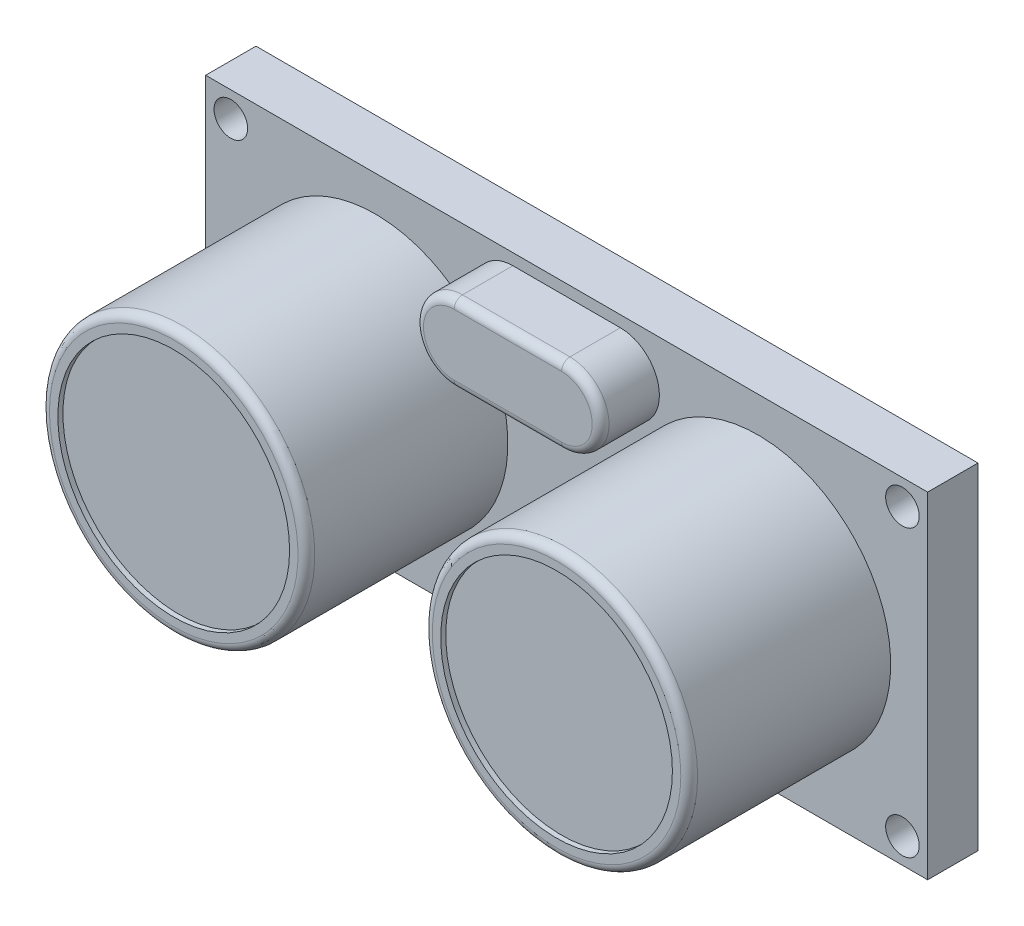
ISO-10303-21;
HEADER;
FILE_DESCRIPTION(('STEP AP214'),'2;1');
FILE_NAME('part.step','',(''),(''),'','','');
FILE_SCHEMA(('AUTOMOTIVE_DESIGN { 1 0 10303 214 1 1 1 1 }'));
ENDSEC;
DATA;
#1=APPLICATION_CONTEXT('core data for automotive mechanical design processes');
#2=APPLICATION_PROTOCOL_DEFINITION('international standard','automotive_design',2000,#1);
#3=PRODUCT_CONTEXT('',#1,'mechanical');
#4=PRODUCT('Part','Part','',(#3));
#5=PRODUCT_RELATED_PRODUCT_CATEGORY('part','',(#4));
#6=PRODUCT_DEFINITION_FORMATION('','',#4);
#7=PRODUCT_DEFINITION_CONTEXT('part definition',#1,'design');
#8=PRODUCT_DEFINITION('design','',#6,#7);
#9=PRODUCT_DEFINITION_SHAPE('','',#8);
#10=(LENGTH_UNIT() NAMED_UNIT(*) SI_UNIT(.MILLI.,.METRE.));
#11=(NAMED_UNIT(*) PLANE_ANGLE_UNIT() SI_UNIT($,.RADIAN.));
#12=(NAMED_UNIT(*) SI_UNIT($,.STERADIAN.) SOLID_ANGLE_UNIT());
#13=UNCERTAINTY_MEASURE_WITH_UNIT(LENGTH_MEASURE(1.E-05),#10,'distance_accuracy_value','');
#14=(GEOMETRIC_REPRESENTATION_CONTEXT(3) GLOBAL_UNCERTAINTY_ASSIGNED_CONTEXT((#13)) GLOBAL_UNIT_ASSIGNED_CONTEXT((#10,
#11,#12)) REPRESENTATION_CONTEXT('',''));
#15=CARTESIAN_POINT('',(0.,0.,0.));
#16=DIRECTION('',(0.,0.,1.));
#17=DIRECTION('',(1.,0.,0.));
#18=AXIS2_PLACEMENT_3D('',#15,#16,#17);
#19=CARTESIAN_POINT('',(0.,0.,3.));
#20=DIRECTION('',(0.,0.,-1.));
#21=DIRECTION('',(-1.,0.,0.));
#22=AXIS2_PLACEMENT_3D('',#19,#20,#21);
#23=PLANE('',#22);
#24=DIRECTION('',(0.,1.,0.));
#25=VECTOR('',#24,1.);
#26=CARTESIAN_POINT('',(21.5,-10.,3.));
#27=LINE('',#26,#25);
#28=CARTESIAN_POINT('',(21.5,-10.,3.));
#29=VERTEX_POINT('',#28);
#30=CARTESIAN_POINT('',(21.5,10.,3.));
#31=VERTEX_POINT('',#30);
#32=EDGE_CURVE('E182',#29,#31,#27,.T.);
#33=ORIENTED_EDGE('',*,*,#32,.T.);
#34=DIRECTION('',(-1.,0.,0.));
#35=VECTOR('',#34,1.);
#36=CARTESIAN_POINT('',(-21.5,10.,3.));
#37=LINE('',#36,#35);
#38=CARTESIAN_POINT('',(-21.5,10.,3.));
#39=VERTEX_POINT('',#38);
#40=EDGE_CURVE('E185',#31,#39,#37,.T.);
#41=ORIENTED_EDGE('',*,*,#40,.T.);
#42=DIRECTION('',(0.,-1.,0.));
#43=VECTOR('',#42,1.);
#44=CARTESIAN_POINT('',(-21.5,-10.,3.));
#45=LINE('',#44,#43);
#46=CARTESIAN_POINT('',(-21.5,-10.,3.));
#47=VERTEX_POINT('',#46);
#48=EDGE_CURVE('E188',#39,#47,#45,.T.);
#49=ORIENTED_EDGE('',*,*,#48,.T.);
#50=DIRECTION('',(1.,0.,0.));
#51=VECTOR('',#50,1.);
#52=CARTESIAN_POINT('',(-21.5,-10.,3.));
#53=LINE('',#52,#51);
#54=EDGE_CURVE('E190',#47,#29,#53,.T.);
#55=ORIENTED_EDGE('',*,*,#54,.T.);
#56=EDGE_LOOP('',(#33,#41,#49,#55));
#57=FACE_BOUND('',#56,.T.);
#58=CARTESIAN_POINT('',(20.,8.5,3.));
#59=DIRECTION('',(0.,0.,-1.));
#60=DIRECTION('',(-1.,0.,0.));
#61=AXIS2_PLACEMENT_3D('',#58,#59,#60);
#62=CIRCLE('',#61,1.);
#63=CARTESIAN_POINT('',(19.,8.5,3.));
#64=VERTEX_POINT('',#63);
#65=EDGE_CURVE('E169',#64,#64,#62,.T.);
#66=ORIENTED_EDGE('',*,*,#65,.T.);
#67=EDGE_LOOP('',(#66));
#68=FACE_BOUND('',#67,.T.);
#69=CARTESIAN_POINT('',(-20.,-8.49999999999999,3.));
#70=DIRECTION('',(0.,0.,-1.));
#71=DIRECTION('',(-1.,0.,0.));
#72=AXIS2_PLACEMENT_3D('',#69,#70,#71);
#73=CIRCLE('',#72,1.);
#74=CARTESIAN_POINT('',(-21.,-8.49999999999999,3.));
#75=VERTEX_POINT('',#74);
#76=EDGE_CURVE('E172',#75,#75,#73,.T.);
#77=ORIENTED_EDGE('',*,*,#76,.T.);
#78=EDGE_LOOP('',(#77));
#79=FACE_BOUND('',#78,.T.);
#80=CARTESIAN_POINT('',(20.,-8.5,3.));
#81=DIRECTION('',(0.,0.,-1.));
#82=DIRECTION('',(-1.,0.,0.));
#83=AXIS2_PLACEMENT_3D('',#80,#81,#82);
#84=CIRCLE('',#83,1.);
#85=CARTESIAN_POINT('',(19.,-8.5,3.));
#86=VERTEX_POINT('',#85);
#87=EDGE_CURVE('E175',#86,#86,#84,.T.);
#88=ORIENTED_EDGE('',*,*,#87,.T.);
#89=EDGE_LOOP('',(#88));
#90=FACE_BOUND('',#89,.T.);
#91=CARTESIAN_POINT('',(-20.,8.49999999999999,3.));
#92=DIRECTION('',(0.,0.,-1.));
#93=DIRECTION('',(-1.,0.,0.));
#94=AXIS2_PLACEMENT_3D('',#91,#92,#93);
#95=CIRCLE('',#94,1.);
#96=CARTESIAN_POINT('',(-21.,8.49999999999999,3.));
#97=VERTEX_POINT('',#96);
#98=EDGE_CURVE('E178',#97,#97,#95,.T.);
#99=ORIENTED_EDGE('',*,*,#98,.T.);
#100=EDGE_LOOP('',(#99));
#101=FACE_BOUND('',#100,.T.);
#102=CARTESIAN_POINT('',(11.4,0.,3.));
#103=DIRECTION('',(0.,0.,-1.));
#104=DIRECTION('',(-1.,0.,0.));
#105=AXIS2_PLACEMENT_3D('',#102,#103,#104);
#106=CIRCLE('',#105,7.9);
#107=CARTESIAN_POINT('',(3.5,0.,3.));
#108=VERTEX_POINT('',#107);
#109=EDGE_CURVE('E211',#108,#108,#106,.F.);
#110=ORIENTED_EDGE('',*,*,#109,.F.);
#111=EDGE_LOOP('',(#110));
#112=FACE_BOUND('',#111,.T.);
#113=CARTESIAN_POINT('',(-11.4,0.,3.));
#114=DIRECTION('',(0.,0.,-1.));
#115=DIRECTION('',(-1.,0.,0.));
#116=AXIS2_PLACEMENT_3D('',#113,#114,#115);
#117=CIRCLE('',#116,7.9);
#118=CARTESIAN_POINT('',(-19.3,0.,3.));
#119=VERTEX_POINT('',#118);
#120=EDGE_CURVE('E214',#119,#119,#117,.F.);
#121=ORIENTED_EDGE('',*,*,#120,.F.);
#122=EDGE_LOOP('',(#121));
#123=FACE_BOUND('',#122,.T.);
#124=CARTESIAN_POINT('',(-3.2,7.,3.));
#125=DIRECTION('',(0.,0.,1.));
#126=DIRECTION('',(1.,0.,0.));
#127=AXIS2_PLACEMENT_3D('',#124,#125,#126);
#128=CIRCLE('',#127,2.325);
#129=CARTESIAN_POINT('',(-3.2,9.325,3.));
#130=VERTEX_POINT('',#129);
#131=CARTESIAN_POINT('',(-3.2,4.675,3.));
#132=VERTEX_POINT('',#131);
#133=EDGE_CURVE('E117',#130,#132,#128,.T.);
#134=ORIENTED_EDGE('',*,*,#133,.F.);
#135=DIRECTION('',(-1.,0.,0.));
#136=VECTOR('',#135,1.);
#137=CARTESIAN_POINT('',(-3.2,9.325,3.));
#138=LINE('',#137,#136);
#139=CARTESIAN_POINT('',(3.2,9.325,3.));
#140=VERTEX_POINT('',#139);
#141=EDGE_CURVE('E124',#140,#130,#138,.T.);
#142=ORIENTED_EDGE('',*,*,#141,.F.);
#143=CARTESIAN_POINT('',(3.2,7.,3.));
#144=DIRECTION('',(0.,0.,1.));
#145=DIRECTION('',(1.,0.,0.));
#146=AXIS2_PLACEMENT_3D('',#143,#144,#145);
#147=CIRCLE('',#146,2.325);
#148=CARTESIAN_POINT('',(3.2,4.675,3.));
#149=VERTEX_POINT('',#148);
#150=EDGE_CURVE('E135',#149,#140,#147,.T.);
#151=ORIENTED_EDGE('',*,*,#150,.F.);
#152=DIRECTION('',(1.,0.,0.));
#153=VECTOR('',#152,1.);
#154=CARTESIAN_POINT('',(-3.2,4.675,3.));
#155=LINE('',#154,#153);
#156=EDGE_CURVE('E132',#132,#149,#155,.T.);
#157=ORIENTED_EDGE('',*,*,#156,.F.);
#158=EDGE_LOOP('',(#134,#142,#151,#157));
#159=FACE_BOUND('',#158,.T.);
#160=ADVANCED_FACE('F36',(#57,#68,#79,#90,#101,#112,#123,#159),#23,.F.);
#161=CARTESIAN_POINT('',(21.5,-10.,3.));
#162=DIRECTION('',(-1.,0.,0.));
#163=DIRECTION('',(0.,0.,1.));
#164=AXIS2_PLACEMENT_3D('',#161,#162,#163);
#165=PLANE('',#164);
#166=DIRECTION('',(0.,1.,0.));
#167=VECTOR('',#166,1.);
#168=CARTESIAN_POINT('',(21.5,-10.,0.));
#169=LINE('',#168,#167);
#170=CARTESIAN_POINT('',(21.5,-10.,0.));
#171=VERTEX_POINT('',#170);
#172=CARTESIAN_POINT('',(21.5,10.,0.));
#173=VERTEX_POINT('',#172);
#174=EDGE_CURVE('E181',#171,#173,#169,.T.);
#175=ORIENTED_EDGE('',*,*,#174,.T.);
#176=DIRECTION('',(0.,0.,-1.));
#177=VECTOR('',#176,1.);
#178=CARTESIAN_POINT('',(21.5,10.,3.));
#179=LINE('',#178,#177);
#180=EDGE_CURVE('E208',#31,#173,#179,.T.);
#181=ORIENTED_EDGE('',*,*,#180,.F.);
#182=ORIENTED_EDGE('',*,*,#32,.F.);
#183=DIRECTION('',(0.,0.,-1.));
#184=VECTOR('',#183,1.);
#185=CARTESIAN_POINT('',(21.5,-10.,3.));
#186=LINE('',#185,#184);
#187=EDGE_CURVE('E192',#29,#171,#186,.T.);
#188=ORIENTED_EDGE('',*,*,#187,.T.);
#189=EDGE_LOOP('',(#175,#181,#182,#188));
#190=FACE_BOUND('',#189,.T.);
#191=ADVANCED_FACE('F275',(#190),#165,.F.);
#192=CARTESIAN_POINT('',(-21.5,10.,3.));
#193=DIRECTION('',(0.,-1.,0.));
#194=DIRECTION('',(0.,0.,-1.));
#195=AXIS2_PLACEMENT_3D('',#192,#193,#194);
#196=PLANE('',#195);
#197=DIRECTION('',(-1.,0.,0.));
#198=VECTOR('',#197,1.);
#199=CARTESIAN_POINT('',(-21.5,10.,0.));
#200=LINE('',#199,#198);
#201=CARTESIAN_POINT('',(-21.5,10.,0.));
#202=VERTEX_POINT('',#201);
#203=EDGE_CURVE('E195',#173,#202,#200,.T.);
#204=ORIENTED_EDGE('',*,*,#203,.T.);
#205=DIRECTION('',(0.,0.,-1.));
#206=VECTOR('',#205,1.);
#207=CARTESIAN_POINT('',(-21.5,10.,3.));
#208=LINE('',#207,#206);
#209=EDGE_CURVE('E205',#39,#202,#208,.T.);
#210=ORIENTED_EDGE('',*,*,#209,.F.);
#211=ORIENTED_EDGE('',*,*,#40,.F.);
#212=ORIENTED_EDGE('',*,*,#180,.T.);
#213=EDGE_LOOP('',(#204,#210,#211,#212));
#214=FACE_BOUND('',#213,.T.);
#215=ADVANCED_FACE('F281',(#214),#196,.F.);
#216=CARTESIAN_POINT('',(-21.5,-10.,3.));
#217=DIRECTION('',(1.,0.,0.));
#218=DIRECTION('',(0.,0.,-1.));
#219=AXIS2_PLACEMENT_3D('',#216,#217,#218);
#220=PLANE('',#219);
#221=DIRECTION('',(0.,-1.,0.));
#222=VECTOR('',#221,1.);
#223=CARTESIAN_POINT('',(-21.5,-10.,0.));
#224=LINE('',#223,#222);
#225=CARTESIAN_POINT('',(-21.5,-10.,0.));
#226=VERTEX_POINT('',#225);
#227=EDGE_CURVE('E197',#202,#226,#224,.T.);
#228=ORIENTED_EDGE('',*,*,#227,.T.);
#229=DIRECTION('',(0.,0.,-1.));
#230=VECTOR('',#229,1.);
#231=CARTESIAN_POINT('',(-21.5,-10.,3.));
#232=LINE('',#231,#230);
#233=EDGE_CURVE('E202',#47,#226,#232,.T.);
#234=ORIENTED_EDGE('',*,*,#233,.F.);
#235=ORIENTED_EDGE('',*,*,#48,.F.);
#236=ORIENTED_EDGE('',*,*,#209,.T.);
#237=EDGE_LOOP('',(#228,#234,#235,#236));
#238=FACE_BOUND('',#237,.T.);
#239=ADVANCED_FACE('F296',(#238),#220,.F.);
#240=CARTESIAN_POINT('',(-21.5,-10.,3.));
#241=DIRECTION('',(0.,1.,0.));
#242=DIRECTION('',(0.,0.,1.));
#243=AXIS2_PLACEMENT_3D('',#240,#241,#242);
#244=PLANE('',#243);
#245=DIRECTION('',(1.,0.,0.));
#246=VECTOR('',#245,1.);
#247=CARTESIAN_POINT('',(-21.5,-10.,0.));
#248=LINE('',#247,#246);
#249=EDGE_CURVE('E186',#226,#171,#248,.T.);
#250=ORIENTED_EDGE('',*,*,#249,.T.);
#251=ORIENTED_EDGE('',*,*,#187,.F.);
#252=ORIENTED_EDGE('',*,*,#54,.F.);
#253=ORIENTED_EDGE('',*,*,#233,.T.);
#254=EDGE_LOOP('',(#250,#251,#252,#253));
#255=FACE_BOUND('',#254,.T.);
#256=ADVANCED_FACE('F292',(#255),#244,.F.);
#257=CARTESIAN_POINT('',(0.,0.,0.));
#258=DIRECTION('',(0.,0.,-1.));
#259=DIRECTION('',(-1.,0.,0.));
#260=AXIS2_PLACEMENT_3D('',#257,#258,#259);
#261=PLANE('',#260);
#262=CARTESIAN_POINT('',(-20.,8.49999999999999,0.));
#263=DIRECTION('',(0.,0.,1.));
#264=DIRECTION('',(-1.,0.,0.));
#265=AXIS2_PLACEMENT_3D('',#262,#263,#264);
#266=CIRCLE('',#265,1.);
#267=CARTESIAN_POINT('',(-21.,8.49999999999999,0.));
#268=VERTEX_POINT('',#267);
#269=EDGE_CURVE('E161',#268,#268,#266,.T.);
#270=ORIENTED_EDGE('',*,*,#269,.T.);
#271=EDGE_LOOP('',(#270));
#272=FACE_BOUND('',#271,.T.);
#273=CARTESIAN_POINT('',(20.,-8.5,0.));
#274=DIRECTION('',(0.,0.,1.));
#275=DIRECTION('',(-1.,0.,0.));
#276=AXIS2_PLACEMENT_3D('',#273,#274,#275);
#277=CIRCLE('',#276,1.);
#278=CARTESIAN_POINT('',(19.,-8.5,0.));
#279=VERTEX_POINT('',#278);
#280=EDGE_CURVE('E160',#279,#279,#277,.T.);
#281=ORIENTED_EDGE('',*,*,#280,.T.);
#282=EDGE_LOOP('',(#281));
#283=FACE_BOUND('',#282,.T.);
#284=CARTESIAN_POINT('',(-20.,-8.49999999999999,0.));
#285=DIRECTION('',(0.,0.,1.));
#286=DIRECTION('',(1.,0.,0.));
#287=AXIS2_PLACEMENT_3D('',#284,#285,#286);
#288=CIRCLE('',#287,1.);
#289=CARTESIAN_POINT('',(-19.,-8.49999999999999,0.));
#290=VERTEX_POINT('',#289);
#291=EDGE_CURVE('E149',#290,#290,#288,.T.);
#292=ORIENTED_EDGE('',*,*,#291,.T.);
#293=EDGE_LOOP('',(#292));
#294=FACE_BOUND('',#293,.T.);
#295=CARTESIAN_POINT('',(20.,8.5,0.));
#296=DIRECTION('',(0.,0.,1.));
#297=DIRECTION('',(1.,0.,0.));
#298=AXIS2_PLACEMENT_3D('',#295,#296,#297);
#299=CIRCLE('',#298,1.);
#300=CARTESIAN_POINT('',(21.,8.5,0.));
#301=VERTEX_POINT('',#300);
#302=EDGE_CURVE('E164',#301,#301,#299,.T.);
#303=ORIENTED_EDGE('',*,*,#302,.T.);
#304=EDGE_LOOP('',(#303));
#305=FACE_BOUND('',#304,.T.);
#306=ORIENTED_EDGE('',*,*,#174,.F.);
#307=ORIENTED_EDGE('',*,*,#249,.F.);
#308=ORIENTED_EDGE('',*,*,#227,.F.);
#309=ORIENTED_EDGE('',*,*,#203,.F.);
#310=EDGE_LOOP('',(#306,#307,#308,#309));
#311=FACE_BOUND('',#310,.T.);
#312=ADVANCED_FACE('F289',(#272,#283,#294,#305,#311),#261,.T.);
#313=CARTESIAN_POINT('',(20.,8.5,0.));
#314=DIRECTION('',(0.,0.,1.));
#315=DIRECTION('',(1.,0.,0.));
#316=AXIS2_PLACEMENT_3D('',#313,#314,#315);
#317=CYLINDRICAL_SURFACE('',#316,1.);
#318=ORIENTED_EDGE('',*,*,#302,.F.);
#319=EDGE_LOOP('',(#318));
#320=FACE_BOUND('',#319,.T.);
#321=ORIENTED_EDGE('',*,*,#65,.F.);
#322=EDGE_LOOP('',(#321));
#323=FACE_BOUND('',#322,.T.);
#324=ADVANCED_FACE('F287',(#320,#323),#317,.F.);
#325=CARTESIAN_POINT('',(-20.,-8.49999999999999,0.));
#326=DIRECTION('',(0.,0.,1.));
#327=DIRECTION('',(1.,0.,0.));
#328=AXIS2_PLACEMENT_3D('',#325,#326,#327);
#329=CYLINDRICAL_SURFACE('',#328,1.);
#330=ORIENTED_EDGE('',*,*,#291,.F.);
#331=EDGE_LOOP('',(#330));
#332=FACE_BOUND('',#331,.T.);
#333=ORIENTED_EDGE('',*,*,#76,.F.);
#334=EDGE_LOOP('',(#333));
#335=FACE_BOUND('',#334,.T.);
#336=ADVANCED_FACE('F470',(#332,#335),#329,.F.);
#337=CARTESIAN_POINT('',(20.,-8.5,0.));
#338=DIRECTION('',(0.,0.,1.));
#339=DIRECTION('',(1.,0.,0.));
#340=AXIS2_PLACEMENT_3D('',#337,#338,#339);
#341=CYLINDRICAL_SURFACE('',#340,1.);
#342=ORIENTED_EDGE('',*,*,#280,.F.);
#343=EDGE_LOOP('',(#342));
#344=FACE_BOUND('',#343,.T.);
#345=ORIENTED_EDGE('',*,*,#87,.F.);
#346=EDGE_LOOP('',(#345));
#347=FACE_BOUND('',#346,.T.);
#348=ADVANCED_FACE('F458',(#344,#347),#341,.F.);
#349=CARTESIAN_POINT('',(-20.,8.49999999999999,0.));
#350=DIRECTION('',(0.,0.,1.));
#351=DIRECTION('',(1.,0.,0.));
#352=AXIS2_PLACEMENT_3D('',#349,#350,#351);
#353=CYLINDRICAL_SURFACE('',#352,1.);
#354=ORIENTED_EDGE('',*,*,#269,.F.);
#355=EDGE_LOOP('',(#354));
#356=FACE_BOUND('',#355,.T.);
#357=ORIENTED_EDGE('',*,*,#98,.F.);
#358=EDGE_LOOP('',(#357));
#359=FACE_BOUND('',#358,.T.);
#360=ADVANCED_FACE('F447',(#356,#359),#353,.F.);
#361=CARTESIAN_POINT('',(11.4,0.,15.));
#362=DIRECTION('',(0.,0.,-1.));
#363=DIRECTION('',(-1.,0.,0.));
#364=AXIS2_PLACEMENT_3D('',#361,#362,#363);
#365=CYLINDRICAL_SURFACE('',#364,7.9);
#366=CARTESIAN_POINT('',(11.4,0.,14.5));
#367=DIRECTION('',(0.,0.,1.));
#368=DIRECTION('',(1.,0.,0.));
#369=AXIS2_PLACEMENT_3D('',#366,#367,#368);
#370=CIRCLE('',#369,7.9);
#371=CARTESIAN_POINT('',(19.3,0.,14.5));
#372=VERTEX_POINT('',#371);
#373=EDGE_CURVE('E220',#372,#372,#370,.F.);
#374=ORIENTED_EDGE('',*,*,#373,.T.);
#375=EDGE_LOOP('',(#374));
#376=FACE_BOUND('',#375,.T.);
#377=ORIENTED_EDGE('',*,*,#109,.T.);
#378=EDGE_LOOP('',(#377));
#379=FACE_BOUND('',#378,.T.);
#380=ADVANCED_FACE('F419',(#376,#379),#365,.T.);
#381=CARTESIAN_POINT('',(11.4,0.,15.));
#382=DIRECTION('',(0.,0.,1.));
#383=DIRECTION('',(1.,0.,0.));
#384=AXIS2_PLACEMENT_3D('',#381,#382,#383);
#385=PLANE('',#384);
#386=CARTESIAN_POINT('',(11.4,0.,15.));
#387=DIRECTION('',(0.,0.,1.));
#388=DIRECTION('',(1.,0.,0.));
#389=AXIS2_PLACEMENT_3D('',#386,#387,#388);
#390=CIRCLE('',#389,6.9);
#391=CARTESIAN_POINT('',(18.3,0.,15.));
#392=VERTEX_POINT('',#391);
#393=EDGE_CURVE('E145',#392,#392,#390,.T.);
#394=ORIENTED_EDGE('',*,*,#393,.F.);
#395=EDGE_LOOP('',(#394));
#396=FACE_BOUND('',#395,.T.);
#397=CARTESIAN_POINT('',(11.4,0.,15.));
#398=DIRECTION('',(0.,0.,1.));
#399=DIRECTION('',(1.,0.,0.));
#400=AXIS2_PLACEMENT_3D('',#397,#398,#399);
#401=CIRCLE('',#400,7.4);
#402=CARTESIAN_POINT('',(18.8,0.,15.));
#403=VERTEX_POINT('',#402);
#404=EDGE_CURVE('E217',#403,#403,#401,.T.);
#405=ORIENTED_EDGE('',*,*,#404,.T.);
#406=EDGE_LOOP('',(#405));
#407=FACE_BOUND('',#406,.T.);
#408=ADVANCED_FACE('F414',(#396,#407),#385,.T.);
#409=CARTESIAN_POINT('',(-11.4,0.,15.));
#410=DIRECTION('',(0.,0.,-1.));
#411=DIRECTION('',(-1.,0.,0.));
#412=AXIS2_PLACEMENT_3D('',#409,#410,#411);
#413=CYLINDRICAL_SURFACE('',#412,7.9);
#414=CARTESIAN_POINT('',(-11.4,0.,14.5));
#415=DIRECTION('',(0.,0.,-1.));
#416=DIRECTION('',(-1.,0.,0.));
#417=AXIS2_PLACEMENT_3D('',#414,#415,#416);
#418=CIRCLE('',#417,7.9);
#419=CARTESIAN_POINT('',(-19.3,0.,14.5));
#420=VERTEX_POINT('',#419);
#421=EDGE_CURVE('E226',#420,#420,#418,.T.);
#422=ORIENTED_EDGE('',*,*,#421,.T.);
#423=EDGE_LOOP('',(#422));
#424=FACE_BOUND('',#423,.T.);
#425=ORIENTED_EDGE('',*,*,#120,.T.);
#426=EDGE_LOOP('',(#425));
#427=FACE_BOUND('',#426,.T.);
#428=ADVANCED_FACE('F405',(#424,#427),#413,.T.);
#429=CARTESIAN_POINT('',(-11.4,0.,15.));
#430=DIRECTION('',(0.,0.,-1.));
#431=DIRECTION('',(-1.,0.,0.));
#432=AXIS2_PLACEMENT_3D('',#429,#430,#431);
#433=PLANE('',#432);
#434=CARTESIAN_POINT('',(-11.4,0.,15.));
#435=DIRECTION('',(0.,0.,1.));
#436=DIRECTION('',(1.,0.,0.));
#437=AXIS2_PLACEMENT_3D('',#434,#435,#436);
#438=CIRCLE('',#437,6.9);
#439=CARTESIAN_POINT('',(-4.5,0.,15.));
#440=VERTEX_POINT('',#439);
#441=EDGE_CURVE('E150',#440,#440,#438,.T.);
#442=ORIENTED_EDGE('',*,*,#441,.F.);
#443=EDGE_LOOP('',(#442));
#444=FACE_BOUND('',#443,.T.);
#445=CARTESIAN_POINT('',(-11.4,0.,15.));
#446=DIRECTION('',(0.,0.,-1.));
#447=DIRECTION('',(-1.,0.,0.));
#448=AXIS2_PLACEMENT_3D('',#445,#446,#447);
#449=CIRCLE('',#448,7.4);
#450=CARTESIAN_POINT('',(-18.8,0.,15.));
#451=VERTEX_POINT('',#450);
#452=EDGE_CURVE('E223',#451,#451,#449,.F.);
#453=ORIENTED_EDGE('',*,*,#452,.T.);
#454=EDGE_LOOP('',(#453));
#455=FACE_BOUND('',#454,.T.);
#456=ADVANCED_FACE('F308',(#444,#455),#433,.F.);
#457=CARTESIAN_POINT('',(11.4,0.,14.5));
#458=DIRECTION('',(0.,0.,1.));
#459=DIRECTION('',(1.,0.,0.));
#460=AXIS2_PLACEMENT_3D('',#457,#458,#459);
#461=TOROIDAL_SURFACE('',#460,7.4,0.5);
#462=ORIENTED_EDGE('',*,*,#373,.F.);
#463=EDGE_LOOP('',(#462));
#464=FACE_BOUND('',#463,.T.);
#465=ORIENTED_EDGE('',*,*,#404,.F.);
#466=EDGE_LOOP('',(#465));
#467=FACE_BOUND('',#466,.T.);
#468=ADVANCED_FACE('F304',(#464,#467),#461,.T.);
#469=CARTESIAN_POINT('',(-11.4,0.,14.5));
#470=DIRECTION('',(0.,0.,-1.));
#471=DIRECTION('',(-1.,0.,0.));
#472=AXIS2_PLACEMENT_3D('',#469,#470,#471);
#473=TOROIDAL_SURFACE('',#472,7.4,0.5);
#474=ORIENTED_EDGE('',*,*,#421,.F.);
#475=EDGE_LOOP('',(#474));
#476=FACE_BOUND('',#475,.T.);
#477=ORIENTED_EDGE('',*,*,#452,.F.);
#478=EDGE_LOOP('',(#477));
#479=FACE_BOUND('',#478,.T.);
#480=ADVANCED_FACE('F307',(#476,#479),#473,.T.);
#481=CARTESIAN_POINT('',(-11.4,0.,14.7));
#482=DIRECTION('',(0.,0.,1.));
#483=DIRECTION('',(1.,0.,0.));
#484=AXIS2_PLACEMENT_3D('',#481,#482,#483);
#485=CYLINDRICAL_SURFACE('',#484,6.9);
#486=CARTESIAN_POINT('',(-11.4,0.,14.7));
#487=DIRECTION('',(0.,0.,1.));
#488=DIRECTION('',(1.,0.,0.));
#489=AXIS2_PLACEMENT_3D('',#486,#487,#488);
#490=CIRCLE('',#489,6.9);
#491=CARTESIAN_POINT('',(-4.5,0.,14.7));
#492=VERTEX_POINT('',#491);
#493=EDGE_CURVE('E146',#492,#492,#490,.T.);
#494=ORIENTED_EDGE('',*,*,#493,.F.);
#495=EDGE_LOOP('',(#494));
#496=FACE_BOUND('',#495,.T.);
#497=ORIENTED_EDGE('',*,*,#441,.T.);
#498=EDGE_LOOP('',(#497));
#499=FACE_BOUND('',#498,.T.);
#500=ADVANCED_FACE('F312',(#496,#499),#485,.F.);
#501=CARTESIAN_POINT('',(-11.4,0.,14.7));
#502=DIRECTION('',(0.,0.,1.));
#503=DIRECTION('',(1.,0.,0.));
#504=AXIS2_PLACEMENT_3D('',#501,#502,#503);
#505=PLANE('',#504);
#506=ORIENTED_EDGE('',*,*,#493,.T.);
#507=EDGE_LOOP('',(#506));
#508=FACE_BOUND('',#507,.T.);
#509=ADVANCED_FACE('F376',(#508),#505,.T.);
#510=CARTESIAN_POINT('',(11.4,0.,14.7));
#511=DIRECTION('',(0.,0.,1.));
#512=DIRECTION('',(1.,0.,0.));
#513=AXIS2_PLACEMENT_3D('',#510,#511,#512);
#514=CYLINDRICAL_SURFACE('',#513,6.9);
#515=CARTESIAN_POINT('',(11.4,0.,14.7));
#516=DIRECTION('',(0.,0.,1.));
#517=DIRECTION('',(1.,0.,0.));
#518=AXIS2_PLACEMENT_3D('',#515,#516,#517);
#519=CIRCLE('',#518,6.9);
#520=CARTESIAN_POINT('',(18.3,0.,14.7));
#521=VERTEX_POINT('',#520);
#522=EDGE_CURVE('E153',#521,#521,#519,.T.);
#523=ORIENTED_EDGE('',*,*,#522,.F.);
#524=EDGE_LOOP('',(#523));
#525=FACE_BOUND('',#524,.T.);
#526=ORIENTED_EDGE('',*,*,#393,.T.);
#527=EDGE_LOOP('',(#526));
#528=FACE_BOUND('',#527,.T.);
#529=ADVANCED_FACE('F365',(#525,#528),#514,.F.);
#530=CARTESIAN_POINT('',(11.4,0.,14.7));
#531=DIRECTION('',(0.,0.,1.));
#532=DIRECTION('',(1.,0.,0.));
#533=AXIS2_PLACEMENT_3D('',#530,#531,#532);
#534=PLANE('',#533);
#535=ORIENTED_EDGE('',*,*,#522,.T.);
#536=EDGE_LOOP('',(#535));
#537=FACE_BOUND('',#536,.T.);
#538=ADVANCED_FACE('F272',(#537),#534,.T.);
#539=CARTESIAN_POINT('',(-3.2,7.,6.5));
#540=DIRECTION('',(0.,0.,-1.));
#541=DIRECTION('',(-1.,0.,0.));
#542=AXIS2_PLACEMENT_3D('',#539,#540,#541);
#543=CYLINDRICAL_SURFACE('',#542,2.325);
#544=DIRECTION('',(0.,0.,-1.));
#545=VECTOR('',#544,1.);
#546=CARTESIAN_POINT('',(-3.2,4.675,6.5));
#547=LINE('',#546,#545);
#548=CARTESIAN_POINT('',(-3.2,4.675,6.));
#549=VERTEX_POINT('',#548);
#550=EDGE_CURVE('E143',#549,#132,#547,.T.);
#551=ORIENTED_EDGE('',*,*,#550,.F.);
#552=CARTESIAN_POINT('',(-3.2,7.,6.));
#553=DIRECTION('',(0.,0.,1.));
#554=DIRECTION('',(1.,0.,0.));
#555=AXIS2_PLACEMENT_3D('',#552,#553,#554);
#556=CIRCLE('',#555,2.325);
#557=CARTESIAN_POINT('',(-3.2,9.325,6.));
#558=VERTEX_POINT('',#557);
#559=EDGE_CURVE('E11',#549,#558,#556,.F.);
#560=ORIENTED_EDGE('',*,*,#559,.T.);
#561=DIRECTION('',(0.,0.,-1.));
#562=VECTOR('',#561,1.);
#563=CARTESIAN_POINT('',(-3.2,9.325,6.5));
#564=LINE('',#563,#562);
#565=EDGE_CURVE('E114',#558,#130,#564,.T.);
#566=ORIENTED_EDGE('',*,*,#565,.T.);
#567=ORIENTED_EDGE('',*,*,#133,.T.);
#568=EDGE_LOOP('',(#551,#560,#566,#567));
#569=FACE_BOUND('',#568,.T.);
#570=ADVANCED_FACE('F116',(#569),#543,.T.);
#571=CARTESIAN_POINT('',(-3.2,4.675,6.5));
#572=DIRECTION('',(0.,1.,0.));
#573=DIRECTION('',(0.,0.,1.));
#574=AXIS2_PLACEMENT_3D('',#571,#572,#573);
#575=PLANE('',#574);
#576=DIRECTION('',(0.,0.,-1.));
#577=VECTOR('',#576,1.);
#578=CARTESIAN_POINT('',(3.2,4.675,6.5));
#579=LINE('',#578,#577);
#580=CARTESIAN_POINT('',(3.2,4.675,6.));
#581=VERTEX_POINT('',#580);
#582=EDGE_CURVE('E141',#581,#149,#579,.T.);
#583=ORIENTED_EDGE('',*,*,#582,.F.);
#584=DIRECTION('',(1.,0.,0.));
#585=VECTOR('',#584,1.);
#586=CARTESIAN_POINT('',(-3.2,4.675,6.));
#587=LINE('',#586,#585);
#588=EDGE_CURVE('E45',#581,#549,#587,.F.);
#589=ORIENTED_EDGE('',*,*,#588,.T.);
#590=ORIENTED_EDGE('',*,*,#550,.T.);
#591=ORIENTED_EDGE('',*,*,#156,.T.);
#592=EDGE_LOOP('',(#583,#589,#590,#591));
#593=FACE_BOUND('',#592,.T.);
#594=ADVANCED_FACE('F264',(#593),#575,.F.);
#595=CARTESIAN_POINT('',(3.2,7.,6.5));
#596=DIRECTION('',(0.,0.,-1.));
#597=DIRECTION('',(-1.,0.,0.));
#598=AXIS2_PLACEMENT_3D('',#595,#596,#597);
#599=CYLINDRICAL_SURFACE('',#598,2.325);
#600=DIRECTION('',(0.,0.,-1.));
#601=VECTOR('',#600,1.);
#602=CARTESIAN_POINT('',(3.2,9.325,6.5));
#603=LINE('',#602,#601);
#604=CARTESIAN_POINT('',(3.2,9.325,6.));
#605=VERTEX_POINT('',#604);
#606=EDGE_CURVE('E123',#605,#140,#603,.T.);
#607=ORIENTED_EDGE('',*,*,#606,.F.);
#608=CARTESIAN_POINT('',(3.2,7.,6.));
#609=DIRECTION('',(0.,0.,1.));
#610=DIRECTION('',(1.,0.,0.));
#611=AXIS2_PLACEMENT_3D('',#608,#609,#610);
#612=CIRCLE('',#611,2.325);
#613=EDGE_CURVE('E60',#605,#581,#612,.F.);
#614=ORIENTED_EDGE('',*,*,#613,.T.);
#615=ORIENTED_EDGE('',*,*,#582,.T.);
#616=ORIENTED_EDGE('',*,*,#150,.T.);
#617=EDGE_LOOP('',(#607,#614,#615,#616));
#618=FACE_BOUND('',#617,.T.);
#619=ADVANCED_FACE('F263',(#618),#599,.T.);
#620=CARTESIAN_POINT('',(-3.2,9.325,6.5));
#621=DIRECTION('',(0.,-1.,0.));
#622=DIRECTION('',(0.,0.,-1.));
#623=AXIS2_PLACEMENT_3D('',#620,#621,#622);
#624=PLANE('',#623);
#625=ORIENTED_EDGE('',*,*,#565,.F.);
#626=DIRECTION('',(-1.,0.,0.));
#627=VECTOR('',#626,1.);
#628=CARTESIAN_POINT('',(3.2,9.325,6.));
#629=LINE('',#628,#627);
#630=EDGE_CURVE('E238',#558,#605,#629,.F.);
#631=ORIENTED_EDGE('',*,*,#630,.T.);
#632=ORIENTED_EDGE('',*,*,#606,.T.);
#633=ORIENTED_EDGE('',*,*,#141,.T.);
#634=EDGE_LOOP('',(#625,#631,#632,#633));
#635=FACE_BOUND('',#634,.T.);
#636=ADVANCED_FACE('F134',(#635),#624,.F.);
#637=CARTESIAN_POINT('',(-3.2,7.,6.5));
#638=DIRECTION('',(0.,0.,1.));
#639=DIRECTION('',(1.,0.,0.));
#640=AXIS2_PLACEMENT_3D('',#637,#638,#639);
#641=PLANE('',#640);
#642=CARTESIAN_POINT('',(3.2,7.,6.5));
#643=DIRECTION('',(0.,0.,1.));
#644=DIRECTION('',(1.,0.,0.));
#645=AXIS2_PLACEMENT_3D('',#642,#643,#644);
#646=CIRCLE('',#645,1.825);
#647=CARTESIAN_POINT('',(3.2,5.175,6.5));
#648=VERTEX_POINT('',#647);
#649=CARTESIAN_POINT('',(3.2,8.825,6.5));
#650=VERTEX_POINT('',#649);
#651=EDGE_CURVE('E233',#648,#650,#646,.T.);
#652=ORIENTED_EDGE('',*,*,#651,.T.);
#653=DIRECTION('',(-1.,0.,0.));
#654=VECTOR('',#653,1.);
#655=CARTESIAN_POINT('',(-3.2,8.825,6.5));
#656=LINE('',#655,#654);
#657=CARTESIAN_POINT('',(-3.2,8.825,6.5));
#658=VERTEX_POINT('',#657);
#659=EDGE_CURVE('E235',#650,#658,#656,.T.);
#660=ORIENTED_EDGE('',*,*,#659,.T.);
#661=CARTESIAN_POINT('',(-3.2,7.,6.5));
#662=DIRECTION('',(0.,0.,1.));
#663=DIRECTION('',(1.,0.,0.));
#664=AXIS2_PLACEMENT_3D('',#661,#662,#663);
#665=CIRCLE('',#664,1.825);
#666=CARTESIAN_POINT('',(-3.2,5.175,6.5));
#667=VERTEX_POINT('',#666);
#668=EDGE_CURVE('E229',#658,#667,#665,.T.);
#669=ORIENTED_EDGE('',*,*,#668,.T.);
#670=DIRECTION('',(1.,0.,0.));
#671=VECTOR('',#670,1.);
#672=CARTESIAN_POINT('',(3.2,5.175,6.5));
#673=LINE('',#672,#671);
#674=EDGE_CURVE('E231',#667,#648,#673,.T.);
#675=ORIENTED_EDGE('',*,*,#674,.T.);
#676=EDGE_LOOP('',(#652,#660,#669,#675));
#677=FACE_BOUND('',#676,.T.);
#678=ADVANCED_FACE('F321',(#677),#641,.T.);
#679=CARTESIAN_POINT('',(-3.2,5.175,6.));
#680=DIRECTION('',(-1.,0.,0.));
#681=DIRECTION('',(0.,0.,1.));
#682=AXIS2_PLACEMENT_3D('',#679,#680,#681);
#683=CYLINDRICAL_SURFACE('',#682,0.5);
#684=CARTESIAN_POINT('',(-3.2,5.175,6.));
#685=DIRECTION('',(-1.,0.,0.));
#686=DIRECTION('',(0.,0.,1.));
#687=AXIS2_PLACEMENT_3D('',#684,#685,#686);
#688=CIRCLE('',#687,0.5);
#689=EDGE_CURVE('E245',#549,#667,#688,.T.);
#690=ORIENTED_EDGE('',*,*,#689,.F.);
#691=ORIENTED_EDGE('',*,*,#588,.F.);
#692=CARTESIAN_POINT('',(3.2,5.175,6.));
#693=DIRECTION('',(1.,0.,0.));
#694=DIRECTION('',(0.,1.,0.));
#695=AXIS2_PLACEMENT_3D('',#692,#693,#694);
#696=CIRCLE('',#695,0.5);
#697=EDGE_CURVE('E40',#648,#581,#696,.T.);
#698=ORIENTED_EDGE('',*,*,#697,.F.);
#699=ORIENTED_EDGE('',*,*,#674,.F.);
#700=EDGE_LOOP('',(#690,#691,#698,#699));
#701=FACE_BOUND('',#700,.T.);
#702=ADVANCED_FACE('F38',(#701),#683,.T.);
#703=CARTESIAN_POINT('',(3.2,7.,6.));
#704=DIRECTION('',(0.,0.,1.));
#705=DIRECTION('',(1.,0.,0.));
#706=AXIS2_PLACEMENT_3D('',#703,#704,#705);
#707=TOROIDAL_SURFACE('',#706,1.825,0.5);
#708=ORIENTED_EDGE('',*,*,#697,.T.);
#709=ORIENTED_EDGE('',*,*,#613,.F.);
#710=CARTESIAN_POINT('',(3.2,8.825,6.));
#711=DIRECTION('',(-1.,0.,0.));
#712=DIRECTION('',(0.,0.,1.));
#713=AXIS2_PLACEMENT_3D('',#710,#711,#712);
#714=CIRCLE('',#713,0.5);
#715=EDGE_CURVE('E244',#650,#605,#714,.T.);
#716=ORIENTED_EDGE('',*,*,#715,.F.);
#717=ORIENTED_EDGE('',*,*,#651,.F.);
#718=EDGE_LOOP('',(#708,#709,#716,#717));
#719=FACE_BOUND('',#718,.T.);
#720=ADVANCED_FACE('F254',(#719),#707,.T.);
#721=CARTESIAN_POINT('',(-3.2,7.,6.));
#722=DIRECTION('',(0.,0.,1.));
#723=DIRECTION('',(1.,0.,0.));
#724=AXIS2_PLACEMENT_3D('',#721,#722,#723);
#725=TOROIDAL_SURFACE('',#724,1.825,0.5);
#726=ORIENTED_EDGE('',*,*,#689,.T.);
#727=ORIENTED_EDGE('',*,*,#668,.F.);
#728=CARTESIAN_POINT('',(-3.2,8.825,6.));
#729=DIRECTION('',(1.,0.,0.));
#730=DIRECTION('',(0.,0.,-1.));
#731=AXIS2_PLACEMENT_3D('',#728,#729,#730);
#732=CIRCLE('',#731,0.5);
#733=EDGE_CURVE('E242',#558,#658,#732,.T.);
#734=ORIENTED_EDGE('',*,*,#733,.F.);
#735=ORIENTED_EDGE('',*,*,#559,.F.);
#736=EDGE_LOOP('',(#726,#727,#734,#735));
#737=FACE_BOUND('',#736,.T.);
#738=ADVANCED_FACE('F259',(#737),#725,.T.);
#739=CARTESIAN_POINT('',(-3.2,8.825,6.));
#740=DIRECTION('',(1.,0.,0.));
#741=DIRECTION('',(0.,0.,-1.));
#742=AXIS2_PLACEMENT_3D('',#739,#740,#741);
#743=CYLINDRICAL_SURFACE('',#742,0.5);
#744=ORIENTED_EDGE('',*,*,#715,.T.);
#745=ORIENTED_EDGE('',*,*,#630,.F.);
#746=ORIENTED_EDGE('',*,*,#733,.T.);
#747=ORIENTED_EDGE('',*,*,#659,.F.);
#748=EDGE_LOOP('',(#744,#745,#746,#747));
#749=FACE_BOUND('',#748,.T.);
#750=ADVANCED_FACE('F262',(#749),#743,.T.);
#751=CLOSED_SHELL('',(#160,#191,#215,#239,#256,#312,#324,#336,#348,#360,#380,#408,#428,#456,
#468,#480,#500,#509,#529,#538,#570,#594,#619,#636,#678,#702,#720,#738,#750));
#752=MANIFOLD_SOLID_BREP('B2',#751);
#753=ADVANCED_BREP_SHAPE_REPRESENTATION('',(#18,#752),#14);
#754=SHAPE_DEFINITION_REPRESENTATION(#9,#753);
ENDSEC;
END-ISO-10303-21;
